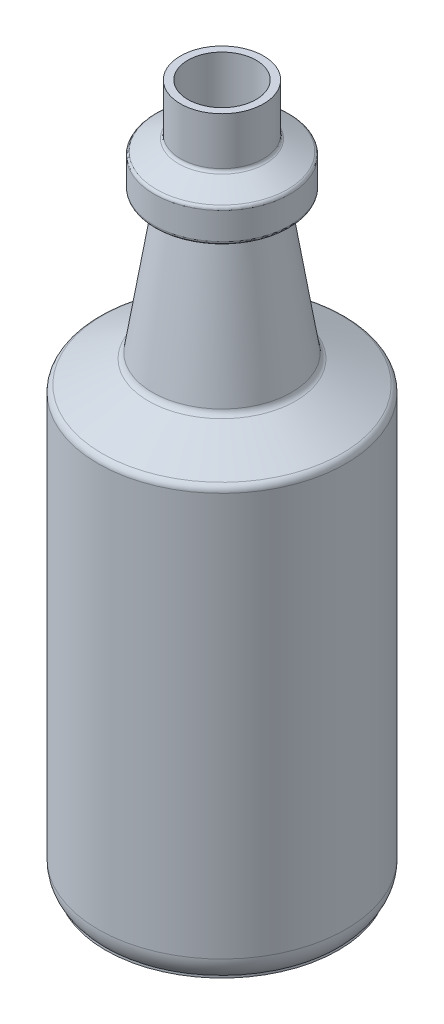
ISO-10303-21;
HEADER;
FILE_DESCRIPTION(('STEP AP214'),'2;1');
FILE_NAME('part.step','',(''),(''),'','','');
FILE_SCHEMA(('AUTOMOTIVE_DESIGN { 1 0 10303 214 1 1 1 1 }'));
ENDSEC;
DATA;
#1=APPLICATION_CONTEXT('core data for automotive mechanical design processes');
#2=APPLICATION_PROTOCOL_DEFINITION('international standard','automotive_design',2000,#1);
#3=PRODUCT_CONTEXT('',#1,'mechanical');
#4=PRODUCT('Part','Part','',(#3));
#5=PRODUCT_RELATED_PRODUCT_CATEGORY('part','',(#4));
#6=PRODUCT_DEFINITION_FORMATION('','',#4);
#7=PRODUCT_DEFINITION_CONTEXT('part definition',#1,'design');
#8=PRODUCT_DEFINITION('design','',#6,#7);
#9=PRODUCT_DEFINITION_SHAPE('','',#8);
#10=(LENGTH_UNIT() NAMED_UNIT(*) SI_UNIT(.MILLI.,.METRE.));
#11=(NAMED_UNIT(*) PLANE_ANGLE_UNIT() SI_UNIT($,.RADIAN.));
#12=(NAMED_UNIT(*) SI_UNIT($,.STERADIAN.) SOLID_ANGLE_UNIT());
#13=UNCERTAINTY_MEASURE_WITH_UNIT(LENGTH_MEASURE(1.E-05),#10,'distance_accuracy_value','');
#14=(GEOMETRIC_REPRESENTATION_CONTEXT(3) GLOBAL_UNCERTAINTY_ASSIGNED_CONTEXT((#13)) GLOBAL_UNIT_ASSIGNED_CONTEXT((#10,
#11,#12)) REPRESENTATION_CONTEXT('',''));
#15=CARTESIAN_POINT('',(0.,0.,0.));
#16=DIRECTION('',(0.,0.,1.));
#17=DIRECTION('',(1.,0.,0.));
#18=AXIS2_PLACEMENT_3D('',#15,#16,#17);
#19=CARTESIAN_POINT('',(0.,0.,0.));
#20=DIRECTION('',(0.,1.,0.));
#21=DIRECTION('',(0.,0.,1.));
#22=AXIS2_PLACEMENT_3D('',#19,#20,#21);
#23=PLANE('',#22);
#24=CARTESIAN_POINT('',(0.,0.,0.));
#25=DIRECTION('',(0.,1.,0.));
#26=DIRECTION('',(0.,0.,1.));
#27=AXIS2_PLACEMENT_3D('',#24,#25,#26);
#28=CIRCLE('',#27,32.4942);
#29=CARTESIAN_POINT('',(0.,0.,32.4942));
#30=VERTEX_POINT('',#29);
#31=EDGE_CURVE('E65',#30,#30,#28,.F.);
#32=ORIENTED_EDGE('',*,*,#31,.T.);
#33=EDGE_LOOP('',(#32));
#34=FACE_BOUND('',#33,.T.);
#35=ADVANCED_FACE('F36',(#34),#23,.F.);
#36=CARTESIAN_POINT('',(0.,0.,0.));
#37=DIRECTION('',(0.,-1.,0.));
#38=DIRECTION('',(0.,0.,-1.));
#39=AXIS2_PLACEMENT_3D('',#36,#37,#38);
#40=CYLINDRICAL_SURFACE('',#39,42.4942);
#41=CARTESIAN_POINT('',(0.,10.,0.));
#42=DIRECTION('',(0.,1.,0.));
#43=DIRECTION('',(0.,0.,1.));
#44=AXIS2_PLACEMENT_3D('',#41,#42,#43);
#45=CIRCLE('',#44,42.4942);
#46=CARTESIAN_POINT('',(0.,10.,42.4942));
#47=VERTEX_POINT('',#46);
#48=EDGE_CURVE('E62',#47,#47,#45,.T.);
#49=ORIENTED_EDGE('',*,*,#48,.T.);
#50=EDGE_LOOP('',(#49));
#51=FACE_BOUND('',#50,.T.);
#52=CARTESIAN_POINT('',(0.,148.42523184615,0.));
#53=DIRECTION('',(0.,1.,0.));
#54=DIRECTION('',(0.,0.,1.));
#55=AXIS2_PLACEMENT_3D('',#52,#53,#54);
#56=CIRCLE('',#55,42.4942);
#57=CARTESIAN_POINT('',(0.,148.42523184615,42.4942));
#58=VERTEX_POINT('',#57);
#59=EDGE_CURVE('E71',#58,#58,#56,.F.);
#60=ORIENTED_EDGE('',*,*,#59,.T.);
#61=EDGE_LOOP('',(#60));
#62=FACE_BOUND('',#61,.T.);
#63=ADVANCED_FACE('F134',(#51,#62),#40,.T.);
#64=CARTESIAN_POINT('',(0.,159.004,0.));
#65=DIRECTION('',(0.,-1.,0.));
#66=DIRECTION('',(0.,0.,-1.));
#67=AXIS2_PLACEMENT_3D('',#64,#65,#66);
#68=CONICAL_SURFACE('',#67,24.0586879780558,1.11701072127637);
#69=CARTESIAN_POINT('',(0.,158.424367999675,0.));
#70=DIRECTION('',(0.,-1.,0.));
#71=DIRECTION('',(0.,0.,-1.));
#72=AXIS2_PLACEMENT_3D('',#69,#70,#71);
#73=CIRCLE('',#72,25.2471096950238);
#74=CARTESIAN_POINT('',(0.,158.424367999675,-25.2471096950238));
#75=VERTEX_POINT('',#74);
#76=EDGE_CURVE('E59',#75,#75,#73,.T.);
#77=ORIENTED_EDGE('',*,*,#76,.T.);
#78=EDGE_LOOP('',(#77));
#79=FACE_BOUND('',#78,.T.);
#80=CARTESIAN_POINT('',(0.,150.70816872375,0.));
#81=DIRECTION('',(0.,1.,0.));
#82=DIRECTION('',(0.,0.,1.));
#83=AXIS2_PLACEMENT_3D('',#80,#81,#82);
#84=CIRCLE('',#83,41.0676627128443);
#85=CARTESIAN_POINT('',(0.,150.70816872375,41.0676627128443));
#86=VERTEX_POINT('',#85);
#87=EDGE_CURVE('E68',#86,#86,#84,.T.);
#88=ORIENTED_EDGE('',*,*,#87,.T.);
#89=EDGE_LOOP('',(#88));
#90=FACE_BOUND('',#89,.T.);
#91=ADVANCED_FACE('F140',(#79,#90),#68,.T.);
#92=CARTESIAN_POINT('',(0.,205.994,0.));
#93=DIRECTION('',(0.,-1.,0.));
#94=DIRECTION('',(0.,0.,-1.));
#95=AXIS2_PLACEMENT_3D('',#92,#93,#94);
#96=CONICAL_SURFACE('',#95,16.6162031272062,0.157079632679483);
#97=CARTESIAN_POINT('',(0.,205.501963918554,0.));
#98=DIRECTION('',(0.,-1.,0.));
#99=DIRECTION('',(0.,0.,-1.));
#100=AXIS2_PLACEMENT_3D('',#97,#98,#99);
#101=CIRCLE('',#100,16.6941339865854);
#102=CARTESIAN_POINT('',(0.,205.501963918554,-16.6941339865854));
#103=VERTEX_POINT('',#102);
#104=EDGE_CURVE('E53',#103,#103,#101,.T.);
#105=ORIENTED_EDGE('',*,*,#104,.T.);
#106=EDGE_LOOP('',(#105));
#107=FACE_BOUND('',#106,.T.);
#108=CARTESIAN_POINT('',(0.,160.309961336073,0.));
#109=DIRECTION('',(0.,-1.,0.));
#110=DIRECTION('',(0.,0.,-1.));
#111=AXIS2_PLACEMENT_3D('',#108,#109,#110);
#112=CIRCLE('',#111,23.8518440227564);
#113=CARTESIAN_POINT('',(0.,160.309961336073,-23.8518440227564));
#114=VERTEX_POINT('',#113);
#115=EDGE_CURVE('E56',#114,#114,#112,.F.);
#116=ORIENTED_EDGE('',*,*,#115,.T.);
#117=EDGE_LOOP('',(#116));
#118=FACE_BOUND('',#117,.T.);
#119=ADVANCED_FACE('F178',(#107,#118),#96,.T.);
#120=CARTESIAN_POINT('',(0.,208.775020776472,0.));
#121=DIRECTION('',(0.,1.,0.));
#122=DIRECTION('',(0.,0.,1.));
#123=AXIS2_PLACEMENT_3D('',#120,#121,#122);
#124=CONICAL_SURFACE('',#123,23.2416,1.17337952739305);
#125=CARTESIAN_POINT('',(0.,206.186810358444,0.));
#126=DIRECTION('',(0.,1.,0.));
#127=DIRECTION('',(0.,0.,1.));
#128=AXIS2_PLACEMENT_3D('',#125,#126,#127);
#129=CIRCLE('',#128,17.0755471050315);
#130=CARTESIAN_POINT('',(0.,206.186810358444,17.0755471050315));
#131=VERTEX_POINT('',#130);
#132=EDGE_CURVE('E48',#131,#131,#129,.T.);
#133=ORIENTED_EDGE('',*,*,#132,.T.);
#134=EDGE_LOOP('',(#133));
#135=FACE_BOUND('',#134,.T.);
#136=CARTESIAN_POINT('',(0.,208.448260106801,0.));
#137=DIRECTION('',(0.,-1.,0.));
#138=DIRECTION('',(0.,0.,-1.));
#139=AXIS2_PLACEMENT_3D('',#136,#137,#138);
#140=CIRCLE('',#139,22.4631379556637);
#141=CARTESIAN_POINT('',(0.,208.448260106801,-22.4631379556637));
#142=VERTEX_POINT('',#141);
#143=EDGE_CURVE('E83',#142,#142,#140,.T.);
#144=ORIENTED_EDGE('',*,*,#143,.T.);
#145=EDGE_LOOP('',(#144));
#146=FACE_BOUND('',#145,.T.);
#147=ADVANCED_FACE('F181',(#135,#146),#124,.T.);
#148=CARTESIAN_POINT('',(0.,0.,0.));
#149=DIRECTION('',(0.,-1.,0.));
#150=DIRECTION('',(0.,0.,-1.));
#151=AXIS2_PLACEMENT_3D('',#148,#149,#150);
#152=CYLINDRICAL_SURFACE('',#151,23.2416);
#153=CARTESIAN_POINT('',(0.,209.619281215979,0.));
#154=DIRECTION('',(0.,1.,0.));
#155=DIRECTION('',(0.,0.,1.));
#156=AXIS2_PLACEMENT_3D('',#153,#154,#155);
#157=CIRCLE('',#156,23.2416);
#158=CARTESIAN_POINT('',(0.,209.619281215979,23.2416));
#159=VERTEX_POINT('',#158);
#160=EDGE_CURVE('E77',#159,#159,#157,.T.);
#161=ORIENTED_EDGE('',*,*,#160,.T.);
#162=EDGE_LOOP('',(#161));
#163=FACE_BOUND('',#162,.T.);
#164=CARTESIAN_POINT('',(0.,218.883905888243,0.));
#165=DIRECTION('',(0.,1.,0.));
#166=DIRECTION('',(0.,0.,1.));
#167=AXIS2_PLACEMENT_3D('',#164,#165,#166);
#168=CIRCLE('',#167,23.2416);
#169=CARTESIAN_POINT('',(0.,218.883905888243,23.2416));
#170=VERTEX_POINT('',#169);
#171=EDGE_CURVE('E80',#170,#170,#168,.F.);
#172=ORIENTED_EDGE('',*,*,#171,.T.);
#173=EDGE_LOOP('',(#172));
#174=FACE_BOUND('',#173,.T.);
#175=ADVANCED_FACE('F130',(#163,#174),#152,.T.);
#176=CARTESIAN_POINT('',(0.,224.2,0.));
#177=DIRECTION('',(0.,-1.,0.));
#178=DIRECTION('',(0.,0.,-1.));
#179=AXIS2_PLACEMENT_3D('',#176,#177,#178);
#180=CONICAL_SURFACE('',#179,14.25,1.10373987749448);
#181=CARTESIAN_POINT('',(0.,223.847935040976,0.));
#182=DIRECTION('',(0.,-1.,0.));
#183=DIRECTION('',(0.,0.,-1.));
#184=AXIS2_PLACEMENT_3D('',#181,#182,#183);
#185=CIRCLE('',#184,14.9481698626144);
#186=CARTESIAN_POINT('',(0.,223.847935040976,-14.9481698626144));
#187=VERTEX_POINT('',#186);
#188=EDGE_CURVE('E44',#187,#187,#185,.T.);
#189=ORIENTED_EDGE('',*,*,#188,.T.);
#190=EDGE_LOOP('',(#189));
#191=FACE_BOUND('',#190,.T.);
#192=CARTESIAN_POINT('',(0.,220.017885735496,0.));
#193=DIRECTION('',(0.,1.,0.));
#194=DIRECTION('',(0.,0.,1.));
#195=AXIS2_PLACEMENT_3D('',#192,#193,#194);
#196=CIRCLE('',#195,22.5434301373856);
#197=CARTESIAN_POINT('',(0.,220.017885735496,22.5434301373856));
#198=VERTEX_POINT('',#197);
#199=EDGE_CURVE('E74',#198,#198,#196,.T.);
#200=ORIENTED_EDGE('',*,*,#199,.T.);
#201=EDGE_LOOP('',(#200));
#202=FACE_BOUND('',#201,.T.);
#203=ADVANCED_FACE('F125',(#191,#202),#180,.T.);
#204=CARTESIAN_POINT('',(0.,0.,0.));
#205=DIRECTION('',(0.,-1.,0.));
#206=DIRECTION('',(0.,0.,-1.));
#207=AXIS2_PLACEMENT_3D('',#204,#205,#206);
#208=CYLINDRICAL_SURFACE('',#207,14.25);
#209=CARTESIAN_POINT('',(0.,224.98191488823,0.));
#210=DIRECTION('',(0.,-1.,0.));
#211=DIRECTION('',(0.,0.,-1.));
#212=AXIS2_PLACEMENT_3D('',#209,#210,#211);
#213=CIRCLE('',#212,14.25);
#214=CARTESIAN_POINT('',(0.,224.98191488823,-14.25));
#215=VERTEX_POINT('',#214);
#216=EDGE_CURVE('E11',#215,#215,#213,.F.);
#217=ORIENTED_EDGE('',*,*,#216,.T.);
#218=EDGE_LOOP('',(#217));
#219=FACE_BOUND('',#218,.T.);
#220=CARTESIAN_POINT('',(0.,241.3,0.));
#221=DIRECTION('',(0.,-1.,0.));
#222=DIRECTION('',(0.,0.,-1.));
#223=AXIS2_PLACEMENT_3D('',#220,#221,#222);
#224=CIRCLE('',#223,14.25);
#225=CARTESIAN_POINT('',(0.,241.3,-14.25));
#226=VERTEX_POINT('',#225);
#227=EDGE_CURVE('E86',#226,#226,#224,.T.);
#228=ORIENTED_EDGE('',*,*,#227,.T.);
#229=EDGE_LOOP('',(#228));
#230=FACE_BOUND('',#229,.T.);
#231=ADVANCED_FACE('F120',(#219,#230),#208,.T.);
#232=CARTESIAN_POINT('',(0.,241.3,0.));
#233=DIRECTION('',(0.,-1.,0.));
#234=DIRECTION('',(0.,0.,-1.));
#235=AXIS2_PLACEMENT_3D('',#232,#233,#234);
#236=PLANE('',#235);
#237=CARTESIAN_POINT('',(0.,241.3,0.));
#238=DIRECTION('',(0.,-1.,0.));
#239=DIRECTION('',(0.,0.,-1.));
#240=AXIS2_PLACEMENT_3D('',#237,#238,#239);
#241=CIRCLE('',#240,11.71);
#242=CARTESIAN_POINT('',(0.,241.3,-11.71));
#243=VERTEX_POINT('',#242);
#244=EDGE_CURVE('E40',#243,#243,#241,.F.);
#245=ORIENTED_EDGE('',*,*,#244,.F.);
#246=EDGE_LOOP('',(#245));
#247=FACE_BOUND('',#246,.T.);
#248=ORIENTED_EDGE('',*,*,#227,.F.);
#249=EDGE_LOOP('',(#248));
#250=FACE_BOUND('',#249,.T.);
#251=ADVANCED_FACE('F116',(#247,#250),#236,.F.);
#252=CARTESIAN_POINT('',(0.,209.619281215979,0.));
#253=DIRECTION('',(0.,1.,0.));
#254=DIRECTION('',(0.,0.,1.));
#255=AXIS2_PLACEMENT_3D('',#252,#253,#254);
#256=TOROIDAL_SURFACE('',#255,21.9716,1.27);
#257=ORIENTED_EDGE('',*,*,#160,.F.);
#258=EDGE_LOOP('',(#257));
#259=FACE_BOUND('',#258,.T.);
#260=ORIENTED_EDGE('',*,*,#143,.F.);
#261=EDGE_LOOP('',(#260));
#262=FACE_BOUND('',#261,.T.);
#263=ADVANCED_FACE('F119',(#259,#262),#256,.T.);
#264=CARTESIAN_POINT('',(0.,218.883905888243,0.));
#265=DIRECTION('',(0.,1.,0.));
#266=DIRECTION('',(0.,0.,1.));
#267=AXIS2_PLACEMENT_3D('',#264,#265,#266);
#268=TOROIDAL_SURFACE('',#267,21.9716,1.27);
#269=ORIENTED_EDGE('',*,*,#199,.F.);
#270=EDGE_LOOP('',(#269));
#271=FACE_BOUND('',#270,.T.);
#272=ORIENTED_EDGE('',*,*,#171,.F.);
#273=EDGE_LOOP('',(#272));
#274=FACE_BOUND('',#273,.T.);
#275=ADVANCED_FACE('F151',(#271,#274),#268,.T.);
#276=CARTESIAN_POINT('',(0.,148.42523184615,0.));
#277=DIRECTION('',(0.,1.,0.));
#278=DIRECTION('',(0.,0.,1.));
#279=AXIS2_PLACEMENT_3D('',#276,#277,#278);
#280=TOROIDAL_SURFACE('',#279,39.9542,2.54);
#281=ORIENTED_EDGE('',*,*,#87,.F.);
#282=EDGE_LOOP('',(#281));
#283=FACE_BOUND('',#282,.T.);
#284=ORIENTED_EDGE('',*,*,#59,.F.);
#285=EDGE_LOOP('',(#284));
#286=FACE_BOUND('',#285,.T.);
#287=ADVANCED_FACE('F155',(#283,#286),#280,.T.);
#288=CARTESIAN_POINT('',(0.,10.,0.));
#289=DIRECTION('',(0.,1.,0.));
#290=DIRECTION('',(0.,0.,1.));
#291=AXIS2_PLACEMENT_3D('',#288,#289,#290);
#292=TOROIDAL_SURFACE('',#291,32.4942,10.);
#293=ORIENTED_EDGE('',*,*,#48,.F.);
#294=EDGE_LOOP('',(#293));
#295=FACE_BOUND('',#294,.T.);
#296=ORIENTED_EDGE('',*,*,#31,.F.);
#297=EDGE_LOOP('',(#296));
#298=FACE_BOUND('',#297,.T.);
#299=ADVANCED_FACE('F159',(#295,#298),#292,.T.);
#300=CARTESIAN_POINT('',(0.,160.707304877275,0.));
#301=DIRECTION('',(0.,-1.,0.));
#302=DIRECTION('',(0.,0.,-1.));
#303=AXIS2_PLACEMENT_3D('',#300,#301,#302);
#304=TOROIDAL_SURFACE('',#303,26.3605724078681,2.54);
#305=ORIENTED_EDGE('',*,*,#115,.F.);
#306=EDGE_LOOP('',(#305));
#307=FACE_BOUND('',#306,.T.);
#308=ORIENTED_EDGE('',*,*,#76,.F.);
#309=EDGE_LOOP('',(#308));
#310=FACE_BOUND('',#309,.T.);
#311=ADVANCED_FACE('F163',(#307,#310),#304,.F.);
#312=CARTESIAN_POINT('',(0.,205.601299803855,0.));
#313=DIRECTION('',(0.,-1.,0.));
#314=DIRECTION('',(0.,0.,-1.));
#315=AXIS2_PLACEMENT_3D('',#312,#313,#314);
#316=TOROIDAL_SURFACE('',#315,17.3213160828633,0.635);
#317=ORIENTED_EDGE('',*,*,#132,.F.);
#318=EDGE_LOOP('',(#317));
#319=FACE_BOUND('',#318,.T.);
#320=ORIENTED_EDGE('',*,*,#104,.F.);
#321=EDGE_LOOP('',(#320));
#322=FACE_BOUND('',#321,.T.);
#323=ADVANCED_FACE('F166',(#319,#322),#316,.F.);
#324=CARTESIAN_POINT('',(0.,224.98191488823,0.));
#325=DIRECTION('',(0.,-1.,0.));
#326=DIRECTION('',(0.,0.,-1.));
#327=AXIS2_PLACEMENT_3D('',#324,#325,#326);
#328=TOROIDAL_SURFACE('',#327,15.52,1.27);
#329=ORIENTED_EDGE('',*,*,#216,.F.);
#330=EDGE_LOOP('',(#329));
#331=FACE_BOUND('',#330,.T.);
#332=ORIENTED_EDGE('',*,*,#188,.F.);
#333=EDGE_LOOP('',(#332));
#334=FACE_BOUND('',#333,.T.);
#335=ADVANCED_FACE('F38',(#331,#334),#328,.F.);
#336=CARTESIAN_POINT('',(0.,2.54,0.));
#337=DIRECTION('',(0.,1.,0.));
#338=DIRECTION('',(0.,0.,1.));
#339=AXIS2_PLACEMENT_3D('',#336,#337,#338);
#340=PLANE('',#339);
#341=CARTESIAN_POINT('',(0.,2.54,0.));
#342=DIRECTION('',(0.,-1.,0.));
#343=DIRECTION('',(0.,0.,-1.));
#344=AXIS2_PLACEMENT_3D('',#341,#342,#343);
#345=CIRCLE('',#344,39.9542);
#346=CARTESIAN_POINT('',(0.,2.54,-39.9542));
#347=VERTEX_POINT('',#346);
#348=EDGE_CURVE('E107',#347,#347,#345,.T.);
#349=ORIENTED_EDGE('',*,*,#348,.F.);
#350=EDGE_LOOP('',(#349));
#351=FACE_BOUND('',#350,.T.);
#352=ADVANCED_FACE('F145',(#351),#340,.T.);
#353=CARTESIAN_POINT('',(0.,0.,0.));
#354=DIRECTION('',(0.,-1.,0.));
#355=DIRECTION('',(0.,0.,-1.));
#356=AXIS2_PLACEMENT_3D('',#353,#354,#355);
#357=CYLINDRICAL_SURFACE('',#356,11.71);
#358=CARTESIAN_POINT('',(0.,222.63617022354,0.));
#359=DIRECTION('',(0.,-1.,0.));
#360=DIRECTION('',(0.,0.,-1.));
#361=AXIS2_PLACEMENT_3D('',#358,#359,#360);
#362=CIRCLE('',#361,11.71);
#363=CARTESIAN_POINT('',(0.,222.63617022354,-11.71));
#364=VERTEX_POINT('',#363);
#365=EDGE_CURVE('E89',#364,#364,#362,.T.);
#366=ORIENTED_EDGE('',*,*,#365,.T.);
#367=EDGE_LOOP('',(#366));
#368=FACE_BOUND('',#367,.T.);
#369=ORIENTED_EDGE('',*,*,#244,.T.);
#370=EDGE_LOOP('',(#369));
#371=FACE_BOUND('',#370,.T.);
#372=ADVANCED_FACE('F114',(#368,#371),#357,.F.);
#373=CARTESIAN_POINT('',(0.,222.63617022354,0.));
#374=DIRECTION('',(0.,-1.,0.));
#375=DIRECTION('',(0.,0.,-1.));
#376=AXIS2_PLACEMENT_3D('',#373,#374,#375);
#377=CONICAL_SURFACE('',#376,11.71,1.10373987749448);
#378=CARTESIAN_POINT('',(0.,218.101991000013,0.));
#379=DIRECTION('',(0.,-1.,0.));
#380=DIRECTION('',(0.,0.,-1.));
#381=AXIS2_PLACEMENT_3D('',#378,#379,#380);
#382=CIRCLE('',#381,20.7016);
#383=CARTESIAN_POINT('',(0.,218.101991000013,-20.7016));
#384=VERTEX_POINT('',#383);
#385=EDGE_CURVE('E92',#384,#384,#382,.T.);
#386=ORIENTED_EDGE('',*,*,#385,.T.);
#387=EDGE_LOOP('',(#386));
#388=FACE_BOUND('',#387,.T.);
#389=ORIENTED_EDGE('',*,*,#365,.F.);
#390=EDGE_LOOP('',(#389));
#391=FACE_BOUND('',#390,.T.);
#392=ADVANCED_FACE('F248',(#388,#391),#377,.F.);
#393=CARTESIAN_POINT('',(0.,0.,0.));
#394=DIRECTION('',(0.,-1.,0.));
#395=DIRECTION('',(0.,0.,-1.));
#396=AXIS2_PLACEMENT_3D('',#393,#394,#395);
#397=CYLINDRICAL_SURFACE('',#396,20.7016);
#398=CARTESIAN_POINT('',(0.,210.463541655486,0.));
#399=DIRECTION('',(0.,-1.,0.));
#400=DIRECTION('',(0.,0.,-1.));
#401=AXIS2_PLACEMENT_3D('',#398,#399,#400);
#402=CIRCLE('',#401,20.7016);
#403=CARTESIAN_POINT('',(0.,210.463541655486,-20.7016));
#404=VERTEX_POINT('',#403);
#405=EDGE_CURVE('E95',#404,#404,#402,.T.);
#406=ORIENTED_EDGE('',*,*,#405,.T.);
#407=EDGE_LOOP('',(#406));
#408=FACE_BOUND('',#407,.T.);
#409=ORIENTED_EDGE('',*,*,#385,.F.);
#410=EDGE_LOOP('',(#409));
#411=FACE_BOUND('',#410,.T.);
#412=ADVANCED_FACE('F261',(#408,#411),#397,.F.);
#413=CARTESIAN_POINT('',(0.,210.463541655486,0.));
#414=DIRECTION('',(0.,1.,0.));
#415=DIRECTION('',(0.,0.,1.));
#416=AXIS2_PLACEMENT_3D('',#413,#414,#415);
#417=CONICAL_SURFACE('',#416,20.7016,1.17337952739304);
#418=CARTESIAN_POINT('',(0.,207.56480078458,0.));
#419=DIRECTION('',(0.,-1.,0.));
#420=DIRECTION('',(0.,0.,-1.));
#421=AXIS2_PLACEMENT_3D('',#418,#419,#420);
#422=CIRCLE('',#421,13.7957513045777);
#423=CARTESIAN_POINT('',(0.,207.56480078458,-13.7957513045777));
#424=VERTEX_POINT('',#423);
#425=EDGE_CURVE('E98',#424,#424,#422,.T.);
#426=ORIENTED_EDGE('',*,*,#425,.T.);
#427=EDGE_LOOP('',(#426));
#428=FACE_BOUND('',#427,.T.);
#429=ORIENTED_EDGE('',*,*,#405,.F.);
#430=EDGE_LOOP('',(#429));
#431=FACE_BOUND('',#430,.T.);
#432=ADVANCED_FACE('F269',(#428,#431),#417,.F.);
#433=CARTESIAN_POINT('',(0.,207.56480078458,0.));
#434=DIRECTION('',(0.,-1.,0.));
#435=DIRECTION('',(0.,0.,-1.));
#436=AXIS2_PLACEMENT_3D('',#433,#434,#435);
#437=CONICAL_SURFACE('',#436,13.7957513045777,0.157079632679483);
#438=CARTESIAN_POINT('',(0.,157.300695122725,0.));
#439=DIRECTION('',(0.,-1.,0.));
#440=DIRECTION('',(0.,0.,-1.));
#441=AXIS2_PLACEMENT_3D('',#438,#439,#440);
#442=CIRCLE('',#441,21.7568035482436);
#443=CARTESIAN_POINT('',(0.,157.300695122725,-21.7568035482436));
#444=VERTEX_POINT('',#443);
#445=EDGE_CURVE('E101',#444,#444,#442,.T.);
#446=ORIENTED_EDGE('',*,*,#445,.T.);
#447=EDGE_LOOP('',(#446));
#448=FACE_BOUND('',#447,.T.);
#449=ORIENTED_EDGE('',*,*,#425,.F.);
#450=EDGE_LOOP('',(#449));
#451=FACE_BOUND('',#450,.T.);
#452=ADVANCED_FACE('F277',(#448,#451),#437,.F.);
#453=CARTESIAN_POINT('',(0.,157.300695122725,0.));
#454=DIRECTION('',(0.,-1.,0.));
#455=DIRECTION('',(0.,0.,-1.));
#456=AXIS2_PLACEMENT_3D('',#453,#454,#455);
#457=CONICAL_SURFACE('',#456,21.7568035482436,1.11701072127637);
#458=CARTESIAN_POINT('',(0.,148.42523184615,0.));
#459=DIRECTION('',(0.,-1.,0.));
#460=DIRECTION('',(0.,0.,-1.));
#461=AXIS2_PLACEMENT_3D('',#458,#459,#460);
#462=CIRCLE('',#461,39.9542);
#463=CARTESIAN_POINT('',(0.,148.42523184615,-39.9542));
#464=VERTEX_POINT('',#463);
#465=EDGE_CURVE('E104',#464,#464,#462,.T.);
#466=ORIENTED_EDGE('',*,*,#465,.T.);
#467=EDGE_LOOP('',(#466));
#468=FACE_BOUND('',#467,.T.);
#469=ORIENTED_EDGE('',*,*,#445,.F.);
#470=EDGE_LOOP('',(#469));
#471=FACE_BOUND('',#470,.T.);
#472=ADVANCED_FACE('F285',(#468,#471),#457,.F.);
#473=CARTESIAN_POINT('',(0.,0.,0.));
#474=DIRECTION('',(0.,-1.,0.));
#475=DIRECTION('',(0.,0.,-1.));
#476=AXIS2_PLACEMENT_3D('',#473,#474,#475);
#477=CYLINDRICAL_SURFACE('',#476,39.9542);
#478=ORIENTED_EDGE('',*,*,#348,.T.);
#479=EDGE_LOOP('',(#478));
#480=FACE_BOUND('',#479,.T.);
#481=ORIENTED_EDGE('',*,*,#465,.F.);
#482=EDGE_LOOP('',(#481));
#483=FACE_BOUND('',#482,.T.);
#484=ADVANCED_FACE('F293',(#480,#483),#477,.F.);
#485=CLOSED_SHELL('',(#35,#63,#91,#119,#147,#175,#203,#231,#251,#263,#275,#287,#299,#311,#323,
#335,#352,#372,#392,#412,#432,#452,#472,#484));
#486=MANIFOLD_SOLID_BREP('B2',#485);
#487=ADVANCED_BREP_SHAPE_REPRESENTATION('',(#18,#486),#14);
#488=SHAPE_DEFINITION_REPRESENTATION(#9,#487);
ENDSEC;
END-ISO-10303-21;
